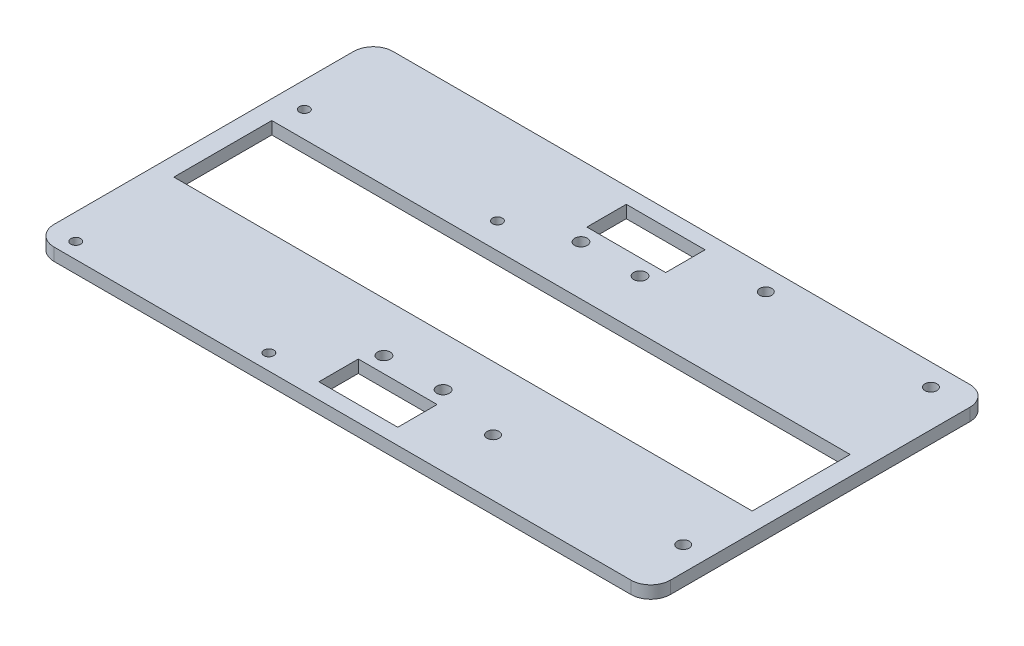
ISO-10303-21;
HEADER;
FILE_DESCRIPTION(('STEP AP214'),'2;1');
FILE_NAME('part.step','',(''),(''),'','','');
FILE_SCHEMA(('AUTOMOTIVE_DESIGN { 1 0 10303 214 1 1 1 1 }'));
ENDSEC;
DATA;
#1=APPLICATION_CONTEXT('core data for automotive mechanical design processes');
#2=APPLICATION_PROTOCOL_DEFINITION('international standard','automotive_design',2000,#1);
#3=PRODUCT_CONTEXT('',#1,'mechanical');
#4=PRODUCT('Part','Part','',(#3));
#5=PRODUCT_RELATED_PRODUCT_CATEGORY('part','',(#4));
#6=PRODUCT_DEFINITION_FORMATION('','',#4);
#7=PRODUCT_DEFINITION_CONTEXT('part definition',#1,'design');
#8=PRODUCT_DEFINITION('design','',#6,#7);
#9=PRODUCT_DEFINITION_SHAPE('','',#8);
#10=(LENGTH_UNIT() NAMED_UNIT(*) SI_UNIT(.MILLI.,.METRE.));
#11=(NAMED_UNIT(*) PLANE_ANGLE_UNIT() SI_UNIT($,.RADIAN.));
#12=(NAMED_UNIT(*) SI_UNIT($,.STERADIAN.) SOLID_ANGLE_UNIT());
#13=UNCERTAINTY_MEASURE_WITH_UNIT(LENGTH_MEASURE(1.E-05),#10,'distance_accuracy_value','');
#14=(GEOMETRIC_REPRESENTATION_CONTEXT(3) GLOBAL_UNCERTAINTY_ASSIGNED_CONTEXT((#13)) GLOBAL_UNIT_ASSIGNED_CONTEXT((#10,
#11,#12)) REPRESENTATION_CONTEXT('',''));
#15=CARTESIAN_POINT('',(0.,0.,0.));
#16=DIRECTION('',(0.,0.,1.));
#17=DIRECTION('',(1.,0.,0.));
#18=AXIS2_PLACEMENT_3D('',#15,#16,#17);
#19=CARTESIAN_POINT('',(78.2,3.175,-43.));
#20=DIRECTION('',(-1.,0.,0.));
#21=DIRECTION('',(0.,0.,1.));
#22=AXIS2_PLACEMENT_3D('',#19,#20,#21);
#23=PLANE('',#22);
#24=DIRECTION('',(0.,0.,-1.));
#25=VECTOR('',#24,1.);
#26=CARTESIAN_POINT('',(78.2,0.,-43.));
#27=LINE('',#26,#25);
#28=CARTESIAN_POINT('',(78.2,0.,38.));
#29=VERTEX_POINT('',#28);
#30=CARTESIAN_POINT('',(78.2,0.,-38.));
#31=VERTEX_POINT('',#30);
#32=EDGE_CURVE('E350',#29,#31,#27,.T.);
#33=ORIENTED_EDGE('',*,*,#32,.T.);
#34=DIRECTION('',(0.,-1.,0.));
#35=VECTOR('',#34,1.);
#36=CARTESIAN_POINT('',(78.2,3.175,-38.));
#37=LINE('',#36,#35);
#38=CARTESIAN_POINT('',(78.2,3.175,-38.));
#39=VERTEX_POINT('',#38);
#40=EDGE_CURVE('E11',#31,#39,#37,.F.);
#41=ORIENTED_EDGE('',*,*,#40,.T.);
#42=DIRECTION('',(0.,0.,-1.));
#43=VECTOR('',#42,1.);
#44=CARTESIAN_POINT('',(78.2,3.175,-43.));
#45=LINE('',#44,#43);
#46=CARTESIAN_POINT('',(78.2,3.175,38.));
#47=VERTEX_POINT('',#46);
#48=EDGE_CURVE('E353',#47,#39,#45,.T.);
#49=ORIENTED_EDGE('',*,*,#48,.F.);
#50=DIRECTION('',(0.,-1.,0.));
#51=VECTOR('',#50,1.);
#52=CARTESIAN_POINT('',(78.2,3.175,38.));
#53=LINE('',#52,#51);
#54=EDGE_CURVE('E43',#47,#29,#53,.T.);
#55=ORIENTED_EDGE('',*,*,#54,.T.);
#56=EDGE_LOOP('',(#33,#41,#49,#55));
#57=FACE_BOUND('',#56,.T.);
#58=ADVANCED_FACE('F35',(#57),#23,.F.);
#59=CARTESIAN_POINT('',(-78.2,3.175,-43.));
#60=DIRECTION('',(0.,0.,1.));
#61=DIRECTION('',(1.,0.,0.));
#62=AXIS2_PLACEMENT_3D('',#59,#60,#61);
#63=PLANE('',#62);
#64=DIRECTION('',(-1.,0.,0.));
#65=VECTOR('',#64,1.);
#66=CARTESIAN_POINT('',(-78.2,0.,-43.));
#67=LINE('',#66,#65);
#68=CARTESIAN_POINT('',(73.2,0.,-43.));
#69=VERTEX_POINT('',#68);
#70=CARTESIAN_POINT('',(-73.2,0.,-43.));
#71=VERTEX_POINT('',#70);
#72=EDGE_CURVE('E367',#69,#71,#67,.T.);
#73=ORIENTED_EDGE('',*,*,#72,.T.);
#74=DIRECTION('',(0.,-1.,0.));
#75=VECTOR('',#74,1.);
#76=CARTESIAN_POINT('',(-73.2,3.175,-43.));
#77=LINE('',#76,#75);
#78=CARTESIAN_POINT('',(-73.2,3.175,-43.));
#79=VERTEX_POINT('',#78);
#80=EDGE_CURVE('E389',#71,#79,#77,.F.);
#81=ORIENTED_EDGE('',*,*,#80,.T.);
#82=DIRECTION('',(-1.,0.,0.));
#83=VECTOR('',#82,1.);
#84=CARTESIAN_POINT('',(-78.2,3.175,-43.));
#85=LINE('',#84,#83);
#86=CARTESIAN_POINT('',(73.2,3.175,-43.));
#87=VERTEX_POINT('',#86);
#88=EDGE_CURVE('E356',#87,#79,#85,.T.);
#89=ORIENTED_EDGE('',*,*,#88,.F.);
#90=DIRECTION('',(0.,-1.,0.));
#91=VECTOR('',#90,1.);
#92=CARTESIAN_POINT('',(73.2,3.175,-43.));
#93=LINE('',#92,#91);
#94=EDGE_CURVE('E386',#87,#69,#93,.T.);
#95=ORIENTED_EDGE('',*,*,#94,.T.);
#96=EDGE_LOOP('',(#73,#81,#89,#95));
#97=FACE_BOUND('',#96,.T.);
#98=ADVANCED_FACE('F420',(#97),#63,.F.);
#99=CARTESIAN_POINT('',(-78.2,3.175,-43.));
#100=DIRECTION('',(1.,0.,0.));
#101=DIRECTION('',(0.,0.,-1.));
#102=AXIS2_PLACEMENT_3D('',#99,#100,#101);
#103=PLANE('',#102);
#104=DIRECTION('',(0.,0.,1.));
#105=VECTOR('',#104,1.);
#106=CARTESIAN_POINT('',(-78.2,3.175,-43.));
#107=LINE('',#106,#105);
#108=CARTESIAN_POINT('',(-78.2,3.175,-38.));
#109=VERTEX_POINT('',#108);
#110=CARTESIAN_POINT('',(-78.2,3.175,38.));
#111=VERTEX_POINT('',#110);
#112=EDGE_CURVE('E360',#109,#111,#107,.T.);
#113=ORIENTED_EDGE('',*,*,#112,.F.);
#114=DIRECTION('',(0.,-1.,0.));
#115=VECTOR('',#114,1.);
#116=CARTESIAN_POINT('',(-78.2,3.175,-38.));
#117=LINE('',#116,#115);
#118=CARTESIAN_POINT('',(-78.2,0.,-38.));
#119=VERTEX_POINT('',#118);
#120=EDGE_CURVE('E375',#109,#119,#117,.T.);
#121=ORIENTED_EDGE('',*,*,#120,.T.);
#122=DIRECTION('',(0.,0.,1.));
#123=VECTOR('',#122,1.);
#124=CARTESIAN_POINT('',(-78.2,0.,-43.));
#125=LINE('',#124,#123);
#126=CARTESIAN_POINT('',(-78.2,0.,38.));
#127=VERTEX_POINT('',#126);
#128=EDGE_CURVE('E370',#119,#127,#125,.T.);
#129=ORIENTED_EDGE('',*,*,#128,.T.);
#130=DIRECTION('',(0.,-1.,0.));
#131=VECTOR('',#130,1.);
#132=CARTESIAN_POINT('',(-78.2,3.175,38.));
#133=LINE('',#132,#131);
#134=EDGE_CURVE('E364',#127,#111,#133,.F.);
#135=ORIENTED_EDGE('',*,*,#134,.T.);
#136=EDGE_LOOP('',(#113,#121,#129,#135));
#137=FACE_BOUND('',#136,.T.);
#138=ADVANCED_FACE('F428',(#137),#103,.F.);
#139=CARTESIAN_POINT('',(-78.2,3.175,43.));
#140=DIRECTION('',(0.,0.,-1.));
#141=DIRECTION('',(-1.,0.,0.));
#142=AXIS2_PLACEMENT_3D('',#139,#140,#141);
#143=PLANE('',#142);
#144=DIRECTION('',(1.,0.,0.));
#145=VECTOR('',#144,1.);
#146=CARTESIAN_POINT('',(-78.2,3.175,43.));
#147=LINE('',#146,#145);
#148=CARTESIAN_POINT('',(-73.2,3.175,43.));
#149=VERTEX_POINT('',#148);
#150=CARTESIAN_POINT('',(73.2,3.175,43.));
#151=VERTEX_POINT('',#150);
#152=EDGE_CURVE('E362',#149,#151,#147,.T.);
#153=ORIENTED_EDGE('',*,*,#152,.F.);
#154=DIRECTION('',(0.,-1.,0.));
#155=VECTOR('',#154,1.);
#156=CARTESIAN_POINT('',(-73.2,3.175,43.));
#157=LINE('',#156,#155);
#158=CARTESIAN_POINT('',(-73.2,0.,43.));
#159=VERTEX_POINT('',#158);
#160=EDGE_CURVE('E399',#149,#159,#157,.T.);
#161=ORIENTED_EDGE('',*,*,#160,.T.);
#162=DIRECTION('',(1.,0.,0.));
#163=VECTOR('',#162,1.);
#164=CARTESIAN_POINT('',(-78.2,0.,43.));
#165=LINE('',#164,#163);
#166=CARTESIAN_POINT('',(73.2,0.,43.));
#167=VERTEX_POINT('',#166);
#168=EDGE_CURVE('E357',#159,#167,#165,.T.);
#169=ORIENTED_EDGE('',*,*,#168,.T.);
#170=DIRECTION('',(0.,-1.,0.));
#171=VECTOR('',#170,1.);
#172=CARTESIAN_POINT('',(73.2,3.175,43.));
#173=LINE('',#172,#171);
#174=EDGE_CURVE('E50',#167,#151,#173,.F.);
#175=ORIENTED_EDGE('',*,*,#174,.T.);
#176=EDGE_LOOP('',(#153,#161,#169,#175));
#177=FACE_BOUND('',#176,.T.);
#178=ADVANCED_FACE('F433',(#177),#143,.F.);
#179=CARTESIAN_POINT('',(0.,3.175,0.));
#180=DIRECTION('',(0.,1.,0.));
#181=DIRECTION('',(0.,0.,1.));
#182=AXIS2_PLACEMENT_3D('',#179,#180,#181);
#183=PLANE('',#182);
#184=DIRECTION('',(0.,0.,1.));
#185=VECTOR('',#184,1.);
#186=CARTESIAN_POINT('',(9.99999999999999,3.175,-29.));
#187=LINE('',#186,#185);
#188=CARTESIAN_POINT('',(9.99999999999999,3.175,-39.));
#189=VERTEX_POINT('',#188);
#190=CARTESIAN_POINT('',(9.99999999999999,3.175,-29.));
#191=VERTEX_POINT('',#190);
#192=EDGE_CURVE('E177',#189,#191,#187,.T.);
#193=ORIENTED_EDGE('',*,*,#192,.T.);
#194=DIRECTION('',(-1.,0.,0.));
#195=VECTOR('',#194,1.);
#196=CARTESIAN_POINT('',(9.99999999999999,3.175,-29.));
#197=LINE('',#196,#195);
#198=CARTESIAN_POINT('',(-10.,3.175,-29.));
#199=VERTEX_POINT('',#198);
#200=EDGE_CURVE('E189',#191,#199,#197,.T.);
#201=ORIENTED_EDGE('',*,*,#200,.T.);
#202=DIRECTION('',(0.,0.,-1.));
#203=VECTOR('',#202,1.);
#204=CARTESIAN_POINT('',(-10.,3.175,-29.));
#205=LINE('',#204,#203);
#206=CARTESIAN_POINT('',(-10.,3.175,-39.));
#207=VERTEX_POINT('',#206);
#208=EDGE_CURVE('E193',#199,#207,#205,.T.);
#209=ORIENTED_EDGE('',*,*,#208,.T.);
#210=DIRECTION('',(1.,0.,0.));
#211=VECTOR('',#210,1.);
#212=CARTESIAN_POINT('',(9.99999999999999,3.175,-39.));
#213=LINE('',#212,#211);
#214=EDGE_CURVE('E185',#207,#189,#213,.T.);
#215=ORIENTED_EDGE('',*,*,#214,.T.);
#216=EDGE_LOOP('',(#193,#201,#209,#215));
#217=FACE_BOUND('',#216,.T.);
#218=DIRECTION('',(0.,0.,-1.));
#219=VECTOR('',#218,1.);
#220=CARTESIAN_POINT('',(-10.,3.175,29.));
#221=LINE('',#220,#219);
#222=CARTESIAN_POINT('',(-10.,3.175,39.));
#223=VERTEX_POINT('',#222);
#224=CARTESIAN_POINT('',(-10.,3.175,29.));
#225=VERTEX_POINT('',#224);
#226=EDGE_CURVE('E217',#223,#225,#221,.T.);
#227=ORIENTED_EDGE('',*,*,#226,.T.);
#228=DIRECTION('',(1.,0.,0.));
#229=VECTOR('',#228,1.);
#230=CARTESIAN_POINT('',(9.99999999999999,3.175,29.));
#231=LINE('',#230,#229);
#232=CARTESIAN_POINT('',(9.99999999999999,3.175,29.));
#233=VERTEX_POINT('',#232);
#234=EDGE_CURVE('E220',#225,#233,#231,.T.);
#235=ORIENTED_EDGE('',*,*,#234,.T.);
#236=DIRECTION('',(0.,0.,1.));
#237=VECTOR('',#236,1.);
#238=CARTESIAN_POINT('',(9.99999999999999,3.175,29.));
#239=LINE('',#238,#237);
#240=CARTESIAN_POINT('',(9.99999999999999,3.175,39.));
#241=VERTEX_POINT('',#240);
#242=EDGE_CURVE('E224',#233,#241,#239,.T.);
#243=ORIENTED_EDGE('',*,*,#242,.T.);
#244=DIRECTION('',(-1.,0.,0.));
#245=VECTOR('',#244,1.);
#246=CARTESIAN_POINT('',(9.99999999999999,3.175,39.));
#247=LINE('',#246,#245);
#248=EDGE_CURVE('E227',#241,#223,#247,.T.);
#249=ORIENTED_EDGE('',*,*,#248,.T.);
#250=EDGE_LOOP('',(#227,#235,#243,#249));
#251=FACE_BOUND('',#250,.T.);
#252=CARTESIAN_POINT('',(7.5,3.175,25.));
#253=DIRECTION('',(0.,-1.,0.));
#254=DIRECTION('',(0.,0.,-1.));
#255=AXIS2_PLACEMENT_3D('',#252,#253,#254);
#256=CIRCLE('',#255,1.6);
#257=CARTESIAN_POINT('',(7.5,3.175,23.4));
#258=VERTEX_POINT('',#257);
#259=EDGE_CURVE('E249',#258,#258,#256,.T.);
#260=ORIENTED_EDGE('',*,*,#259,.T.);
#261=EDGE_LOOP('',(#260));
#262=FACE_BOUND('',#261,.T.);
#263=CARTESIAN_POINT('',(-7.5,3.175,25.));
#264=DIRECTION('',(0.,-1.,0.));
#265=DIRECTION('',(0.,0.,-1.));
#266=AXIS2_PLACEMENT_3D('',#263,#264,#265);
#267=CIRCLE('',#266,1.6);
#268=CARTESIAN_POINT('',(-7.5,3.175,23.4));
#269=VERTEX_POINT('',#268);
#270=EDGE_CURVE('E255',#269,#269,#267,.T.);
#271=ORIENTED_EDGE('',*,*,#270,.T.);
#272=EDGE_LOOP('',(#271));
#273=FACE_BOUND('',#272,.T.);
#274=CARTESIAN_POINT('',(-7.5,3.175,-25.));
#275=DIRECTION('',(0.,-1.,0.));
#276=DIRECTION('',(0.,0.,-1.));
#277=AXIS2_PLACEMENT_3D('',#274,#275,#276);
#278=CIRCLE('',#277,1.6);
#279=CARTESIAN_POINT('',(-7.5,3.175,-26.6));
#280=VERTEX_POINT('',#279);
#281=EDGE_CURVE('E261',#280,#280,#278,.T.);
#282=ORIENTED_EDGE('',*,*,#281,.T.);
#283=EDGE_LOOP('',(#282));
#284=FACE_BOUND('',#283,.T.);
#285=CARTESIAN_POINT('',(7.5,3.175,-25.));
#286=DIRECTION('',(0.,-1.,0.));
#287=DIRECTION('',(0.,0.,-1.));
#288=AXIS2_PLACEMENT_3D('',#285,#286,#287);
#289=CIRCLE('',#288,1.6);
#290=CARTESIAN_POINT('',(7.5,3.175,-26.6));
#291=VERTEX_POINT('',#290);
#292=EDGE_CURVE('E267',#291,#291,#289,.T.);
#293=ORIENTED_EDGE('',*,*,#292,.T.);
#294=EDGE_LOOP('',(#293));
#295=FACE_BOUND('',#294,.T.);
#296=DIRECTION('',(-1.,0.,0.));
#297=VECTOR('',#296,1.);
#298=CARTESIAN_POINT('',(73.39,3.175,12.4299999999999));
#299=LINE('',#298,#297);
#300=CARTESIAN_POINT('',(73.39,3.175,12.4299999999999));
#301=VERTEX_POINT('',#300);
#302=CARTESIAN_POINT('',(-73.39,3.175,12.4299999999999));
#303=VERTEX_POINT('',#302);
#304=EDGE_CURVE('E273',#301,#303,#299,.T.);
#305=ORIENTED_EDGE('',*,*,#304,.T.);
#306=DIRECTION('',(0.,0.,-1.));
#307=VECTOR('',#306,1.);
#308=CARTESIAN_POINT('',(-73.39,3.175,12.4299999999999));
#309=LINE('',#308,#307);
#310=CARTESIAN_POINT('',(-73.39,3.175,-12.4300000000001));
#311=VERTEX_POINT('',#310);
#312=EDGE_CURVE('E276',#303,#311,#309,.T.);
#313=ORIENTED_EDGE('',*,*,#312,.T.);
#314=DIRECTION('',(1.,0.,0.));
#315=VECTOR('',#314,1.);
#316=CARTESIAN_POINT('',(-73.39,3.175,-12.4300000000001));
#317=LINE('',#316,#315);
#318=CARTESIAN_POINT('',(73.39,3.175,-12.4300000000001));
#319=VERTEX_POINT('',#318);
#320=EDGE_CURVE('E280',#311,#319,#317,.T.);
#321=ORIENTED_EDGE('',*,*,#320,.T.);
#322=DIRECTION('',(0.,0.,1.));
#323=VECTOR('',#322,1.);
#324=CARTESIAN_POINT('',(73.39,3.175,-12.4300000000001));
#325=LINE('',#324,#323);
#326=EDGE_CURVE('E283',#319,#301,#325,.T.);
#327=ORIENTED_EDGE('',*,*,#326,.T.);
#328=EDGE_LOOP('',(#305,#313,#321,#327));
#329=FACE_BOUND('',#328,.T.);
#330=CARTESIAN_POINT('',(26.9399999999996,3.175,-37.4649999999998));
#331=DIRECTION('',(0.,-1.,0.));
#332=DIRECTION('',(0.,0.,-1.));
#333=AXIS2_PLACEMENT_3D('',#330,#331,#332);
#334=CIRCLE('',#333,1.52399999999991);
#335=CARTESIAN_POINT('',(26.9399999999996,3.175,-38.9889999999997));
#336=VERTEX_POINT('',#335);
#337=EDGE_CURVE('E305',#336,#336,#334,.T.);
#338=ORIENTED_EDGE('',*,*,#337,.T.);
#339=EDGE_LOOP('',(#338));
#340=FACE_BOUND('',#339,.T.);
#341=CARTESIAN_POINT('',(68.8499999999996,3.175,-37.4649999999999));
#342=DIRECTION('',(0.,-1.,0.));
#343=DIRECTION('',(0.,0.,-1.));
#344=AXIS2_PLACEMENT_3D('',#341,#342,#343);
#345=CIRCLE('',#344,1.5239999999999);
#346=CARTESIAN_POINT('',(68.8499999999996,3.175,-38.9889999999998));
#347=VERTEX_POINT('',#346);
#348=EDGE_CURVE('E311',#347,#347,#345,.T.);
#349=ORIENTED_EDGE('',*,*,#348,.T.);
#350=EDGE_LOOP('',(#349));
#351=FACE_BOUND('',#350,.T.);
#352=CARTESIAN_POINT('',(23.7649999999998,3.175,28.5750000000002));
#353=DIRECTION('',(0.,-1.,0.));
#354=DIRECTION('',(0.,0.,-1.));
#355=AXIS2_PLACEMENT_3D('',#352,#353,#354);
#356=CIRCLE('',#355,1.5239999999999);
#357=CARTESIAN_POINT('',(23.7649999999998,3.175,27.0510000000003));
#358=VERTEX_POINT('',#357);
#359=EDGE_CURVE('E317',#358,#358,#356,.T.);
#360=ORIENTED_EDGE('',*,*,#359,.T.);
#361=EDGE_LOOP('',(#360));
#362=FACE_BOUND('',#361,.T.);
#363=CARTESIAN_POINT('',(72.0249999999998,3.175,28.575));
#364=DIRECTION('',(0.,-1.,0.));
#365=DIRECTION('',(0.,0.,-1.));
#366=AXIS2_PLACEMENT_3D('',#363,#364,#365);
#367=CIRCLE('',#366,1.5239999999999);
#368=CARTESIAN_POINT('',(72.0249999999998,3.175,27.0510000000001));
#369=VERTEX_POINT('',#368);
#370=EDGE_CURVE('E323',#369,#369,#367,.T.);
#371=ORIENTED_EDGE('',*,*,#370,.T.);
#372=EDGE_LOOP('',(#371));
#373=FACE_BOUND('',#372,.T.);
#374=CARTESIAN_POINT('',(-22.6999999999866,3.175,39.0000000000137));
#375=DIRECTION('',(0.,-1.,0.));
#376=DIRECTION('',(0.,0.,-1.));
#377=AXIS2_PLACEMENT_3D('',#374,#375,#376);
#378=CIRCLE('',#377,1.24999999998659);
#379=CARTESIAN_POINT('',(-22.6999999999866,3.175,37.7500000000271));
#380=VERTEX_POINT('',#379);
#381=EDGE_CURVE('E329',#380,#380,#378,.T.);
#382=ORIENTED_EDGE('',*,*,#381,.T.);
#383=EDGE_LOOP('',(#382));
#384=FACE_BOUND('',#383,.T.);
#385=CARTESIAN_POINT('',(-71.6999999999725,3.175,39.0000000000137));
#386=DIRECTION('',(0.,-1.,0.));
#387=DIRECTION('',(0.,0.,-1.));
#388=AXIS2_PLACEMENT_3D('',#385,#386,#387);
#389=CIRCLE('',#388,1.24999999998656);
#390=CARTESIAN_POINT('',(-71.6999999999725,3.175,37.7500000000271));
#391=VERTEX_POINT('',#390);
#392=EDGE_CURVE('E335',#391,#391,#389,.T.);
#393=ORIENTED_EDGE('',*,*,#392,.T.);
#394=EDGE_LOOP('',(#393));
#395=FACE_BOUND('',#394,.T.);
#396=CARTESIAN_POINT('',(-71.6999999999725,3.175,-18.9999999999863));
#397=DIRECTION('',(0.,-1.,0.));
#398=DIRECTION('',(0.,0.,-1.));
#399=AXIS2_PLACEMENT_3D('',#396,#397,#398);
#400=CIRCLE('',#399,1.24999999998654);
#401=CARTESIAN_POINT('',(-71.6999999999725,3.175,-20.2499999999728));
#402=VERTEX_POINT('',#401);
#403=EDGE_CURVE('E341',#402,#402,#400,.T.);
#404=ORIENTED_EDGE('',*,*,#403,.T.);
#405=EDGE_LOOP('',(#404));
#406=FACE_BOUND('',#405,.T.);
#407=CARTESIAN_POINT('',(-22.6999999999865,3.175,-18.9999999999863));
#408=DIRECTION('',(0.,-1.,0.));
#409=DIRECTION('',(0.,0.,-1.));
#410=AXIS2_PLACEMENT_3D('',#407,#408,#409);
#411=CIRCLE('',#410,1.24999999998654);
#412=CARTESIAN_POINT('',(-22.6999999999865,3.175,-20.2499999999728));
#413=VERTEX_POINT('',#412);
#414=EDGE_CURVE('E347',#413,#413,#411,.T.);
#415=ORIENTED_EDGE('',*,*,#414,.T.);
#416=EDGE_LOOP('',(#415));
#417=FACE_BOUND('',#416,.T.);
#418=ORIENTED_EDGE('',*,*,#88,.T.);
#419=CARTESIAN_POINT('',(-73.2,3.175,-38.));
#420=DIRECTION('',(0.,1.,0.));
#421=DIRECTION('',(0.,0.,1.));
#422=AXIS2_PLACEMENT_3D('',#419,#420,#421);
#423=CIRCLE('',#422,5.);
#424=EDGE_CURVE('E396',#79,#109,#423,.T.);
#425=ORIENTED_EDGE('',*,*,#424,.T.);
#426=ORIENTED_EDGE('',*,*,#112,.T.);
#427=CARTESIAN_POINT('',(-73.2,3.175,38.));
#428=DIRECTION('',(0.,1.,0.));
#429=DIRECTION('',(0.,0.,1.));
#430=AXIS2_PLACEMENT_3D('',#427,#428,#429);
#431=CIRCLE('',#430,5.);
#432=EDGE_CURVE('E57',#111,#149,#431,.T.);
#433=ORIENTED_EDGE('',*,*,#432,.T.);
#434=ORIENTED_EDGE('',*,*,#152,.T.);
#435=CARTESIAN_POINT('',(73.2,3.175,38.));
#436=DIRECTION('',(0.,1.,0.));
#437=DIRECTION('',(0.,0.,1.));
#438=AXIS2_PLACEMENT_3D('',#435,#436,#437);
#439=CIRCLE('',#438,5.);
#440=EDGE_CURVE('E391',#151,#47,#439,.T.);
#441=ORIENTED_EDGE('',*,*,#440,.T.);
#442=ORIENTED_EDGE('',*,*,#48,.T.);
#443=CARTESIAN_POINT('',(73.2,3.175,-38.));
#444=DIRECTION('',(0.,1.,0.));
#445=DIRECTION('',(0.,0.,1.));
#446=AXIS2_PLACEMENT_3D('',#443,#444,#445);
#447=CIRCLE('',#446,5.);
#448=EDGE_CURVE('E393',#39,#87,#447,.T.);
#449=ORIENTED_EDGE('',*,*,#448,.T.);
#450=EDGE_LOOP('',(#418,#425,#426,#433,#434,#441,#442,#449));
#451=FACE_BOUND('',#450,.T.);
#452=ADVANCED_FACE('F195',(#217,#251,#262,#273,#284,#295,#329,#340,#351,#362,#373,#384,#395,
#406,#417,#451),#183,.T.);
#453=CARTESIAN_POINT('',(0.,0.,0.));
#454=DIRECTION('',(0.,1.,0.));
#455=DIRECTION('',(0.,0.,1.));
#456=AXIS2_PLACEMENT_3D('',#453,#454,#455);
#457=PLANE('',#456);
#458=DIRECTION('',(-1.,0.,0.));
#459=VECTOR('',#458,1.);
#460=CARTESIAN_POINT('',(9.99999999999999,0.,-29.));
#461=LINE('',#460,#459);
#462=CARTESIAN_POINT('',(9.99999999999999,0.,-29.));
#463=VERTEX_POINT('',#462);
#464=CARTESIAN_POINT('',(-10.,0.,-29.));
#465=VERTEX_POINT('',#464);
#466=EDGE_CURVE('E207',#463,#465,#461,.T.);
#467=ORIENTED_EDGE('',*,*,#466,.F.);
#468=DIRECTION('',(0.,0.,1.));
#469=VECTOR('',#468,1.);
#470=CARTESIAN_POINT('',(9.99999999999999,0.,-29.));
#471=LINE('',#470,#469);
#472=CARTESIAN_POINT('',(9.99999999999999,0.,-39.));
#473=VERTEX_POINT('',#472);
#474=EDGE_CURVE('E180',#473,#463,#471,.T.);
#475=ORIENTED_EDGE('',*,*,#474,.F.);
#476=DIRECTION('',(1.,0.,0.));
#477=VECTOR('',#476,1.);
#478=CARTESIAN_POINT('',(9.99999999999999,0.,-39.));
#479=LINE('',#478,#477);
#480=CARTESIAN_POINT('',(-10.,0.,-39.));
#481=VERTEX_POINT('',#480);
#482=EDGE_CURVE('E198',#481,#473,#479,.T.);
#483=ORIENTED_EDGE('',*,*,#482,.F.);
#484=DIRECTION('',(0.,0.,-1.));
#485=VECTOR('',#484,1.);
#486=CARTESIAN_POINT('',(-10.,0.,-29.));
#487=LINE('',#486,#485);
#488=EDGE_CURVE('E201',#465,#481,#487,.T.);
#489=ORIENTED_EDGE('',*,*,#488,.F.);
#490=EDGE_LOOP('',(#467,#475,#483,#489));
#491=FACE_BOUND('',#490,.T.);
#492=DIRECTION('',(1.,0.,0.));
#493=VECTOR('',#492,1.);
#494=CARTESIAN_POINT('',(9.99999999999999,0.,29.));
#495=LINE('',#494,#493);
#496=CARTESIAN_POINT('',(-10.,0.,29.));
#497=VERTEX_POINT('',#496);
#498=CARTESIAN_POINT('',(9.99999999999999,0.,29.));
#499=VERTEX_POINT('',#498);
#500=EDGE_CURVE('E232',#497,#499,#495,.T.);
#501=ORIENTED_EDGE('',*,*,#500,.F.);
#502=DIRECTION('',(0.,0.,-1.));
#503=VECTOR('',#502,1.);
#504=CARTESIAN_POINT('',(-10.,0.,29.));
#505=LINE('',#504,#503);
#506=CARTESIAN_POINT('',(-10.,0.,39.));
#507=VERTEX_POINT('',#506);
#508=EDGE_CURVE('E213',#507,#497,#505,.T.);
#509=ORIENTED_EDGE('',*,*,#508,.F.);
#510=DIRECTION('',(-1.,0.,0.));
#511=VECTOR('',#510,1.);
#512=CARTESIAN_POINT('',(9.99999999999999,0.,39.));
#513=LINE('',#512,#511);
#514=CARTESIAN_POINT('',(9.99999999999999,0.,39.));
#515=VERTEX_POINT('',#514);
#516=EDGE_CURVE('E221',#515,#507,#513,.T.);
#517=ORIENTED_EDGE('',*,*,#516,.F.);
#518=DIRECTION('',(0.,0.,1.));
#519=VECTOR('',#518,1.);
#520=CARTESIAN_POINT('',(9.99999999999999,0.,29.));
#521=LINE('',#520,#519);
#522=EDGE_CURVE('E235',#499,#515,#521,.T.);
#523=ORIENTED_EDGE('',*,*,#522,.F.);
#524=EDGE_LOOP('',(#501,#509,#517,#523));
#525=FACE_BOUND('',#524,.T.);
#526=CARTESIAN_POINT('',(7.5,0.,25.));
#527=DIRECTION('',(0.,-1.,0.));
#528=DIRECTION('',(0.,0.,-1.));
#529=AXIS2_PLACEMENT_3D('',#526,#527,#528);
#530=CIRCLE('',#529,1.6);
#531=CARTESIAN_POINT('',(7.5,0.,23.4));
#532=VERTEX_POINT('',#531);
#533=EDGE_CURVE('E242',#532,#532,#530,.T.);
#534=ORIENTED_EDGE('',*,*,#533,.F.);
#535=EDGE_LOOP('',(#534));
#536=FACE_BOUND('',#535,.T.);
#537=CARTESIAN_POINT('',(-7.5,0.,25.));
#538=DIRECTION('',(0.,-1.,0.));
#539=DIRECTION('',(0.,0.,-1.));
#540=AXIS2_PLACEMENT_3D('',#537,#538,#539);
#541=CIRCLE('',#540,1.6);
#542=CARTESIAN_POINT('',(-7.5,0.,23.4));
#543=VERTEX_POINT('',#542);
#544=EDGE_CURVE('E252',#543,#543,#541,.T.);
#545=ORIENTED_EDGE('',*,*,#544,.F.);
#546=EDGE_LOOP('',(#545));
#547=FACE_BOUND('',#546,.T.);
#548=CARTESIAN_POINT('',(-7.5,0.,-25.));
#549=DIRECTION('',(0.,-1.,0.));
#550=DIRECTION('',(0.,0.,-1.));
#551=AXIS2_PLACEMENT_3D('',#548,#549,#550);
#552=CIRCLE('',#551,1.6);
#553=CARTESIAN_POINT('',(-7.5,0.,-26.6));
#554=VERTEX_POINT('',#553);
#555=EDGE_CURVE('E258',#554,#554,#552,.T.);
#556=ORIENTED_EDGE('',*,*,#555,.F.);
#557=EDGE_LOOP('',(#556));
#558=FACE_BOUND('',#557,.T.);
#559=CARTESIAN_POINT('',(7.5,0.,-25.));
#560=DIRECTION('',(0.,-1.,0.));
#561=DIRECTION('',(0.,0.,-1.));
#562=AXIS2_PLACEMENT_3D('',#559,#560,#561);
#563=CIRCLE('',#562,1.6);
#564=CARTESIAN_POINT('',(7.5,0.,-26.6));
#565=VERTEX_POINT('',#564);
#566=EDGE_CURVE('E264',#565,#565,#563,.T.);
#567=ORIENTED_EDGE('',*,*,#566,.F.);
#568=EDGE_LOOP('',(#567));
#569=FACE_BOUND('',#568,.T.);
#570=DIRECTION('',(0.,0.,-1.));
#571=VECTOR('',#570,1.);
#572=CARTESIAN_POINT('',(-73.39,0.,12.4299999999999));
#573=LINE('',#572,#571);
#574=CARTESIAN_POINT('',(-73.39,0.,12.4299999999999));
#575=VERTEX_POINT('',#574);
#576=CARTESIAN_POINT('',(-73.39,0.,-12.4300000000001));
#577=VERTEX_POINT('',#576);
#578=EDGE_CURVE('E288',#575,#577,#573,.T.);
#579=ORIENTED_EDGE('',*,*,#578,.F.);
#580=DIRECTION('',(-1.,0.,0.));
#581=VECTOR('',#580,1.);
#582=CARTESIAN_POINT('',(73.39,0.,12.4299999999999));
#583=LINE('',#582,#581);
#584=CARTESIAN_POINT('',(73.39,0.,12.4299999999999));
#585=VERTEX_POINT('',#584);
#586=EDGE_CURVE('E270',#585,#575,#583,.T.);
#587=ORIENTED_EDGE('',*,*,#586,.F.);
#588=DIRECTION('',(0.,0.,1.));
#589=VECTOR('',#588,1.);
#590=CARTESIAN_POINT('',(73.39,0.,-12.4300000000001));
#591=LINE('',#590,#589);
#592=CARTESIAN_POINT('',(73.39,0.,-12.4300000000001));
#593=VERTEX_POINT('',#592);
#594=EDGE_CURVE('E277',#593,#585,#591,.T.);
#595=ORIENTED_EDGE('',*,*,#594,.F.);
#596=DIRECTION('',(1.,0.,0.));
#597=VECTOR('',#596,1.);
#598=CARTESIAN_POINT('',(-73.39,0.,-12.4300000000001));
#599=LINE('',#598,#597);
#600=EDGE_CURVE('E291',#577,#593,#599,.T.);
#601=ORIENTED_EDGE('',*,*,#600,.F.);
#602=EDGE_LOOP('',(#579,#587,#595,#601));
#603=FACE_BOUND('',#602,.T.);
#604=CARTESIAN_POINT('',(26.9399999999996,0.,-37.4649999999998));
#605=DIRECTION('',(0.,-1.,0.));
#606=DIRECTION('',(0.,0.,-1.));
#607=AXIS2_PLACEMENT_3D('',#604,#605,#606);
#608=CIRCLE('',#607,1.52399999999991);
#609=CARTESIAN_POINT('',(26.9399999999996,0.,-38.9889999999997));
#610=VERTEX_POINT('',#609);
#611=EDGE_CURVE('E298',#610,#610,#608,.T.);
#612=ORIENTED_EDGE('',*,*,#611,.F.);
#613=EDGE_LOOP('',(#612));
#614=FACE_BOUND('',#613,.T.);
#615=CARTESIAN_POINT('',(68.8499999999996,0.,-37.4649999999999));
#616=DIRECTION('',(0.,-1.,0.));
#617=DIRECTION('',(0.,0.,-1.));
#618=AXIS2_PLACEMENT_3D('',#615,#616,#617);
#619=CIRCLE('',#618,1.5239999999999);
#620=CARTESIAN_POINT('',(68.8499999999996,0.,-38.9889999999998));
#621=VERTEX_POINT('',#620);
#622=EDGE_CURVE('E308',#621,#621,#619,.T.);
#623=ORIENTED_EDGE('',*,*,#622,.F.);
#624=EDGE_LOOP('',(#623));
#625=FACE_BOUND('',#624,.T.);
#626=CARTESIAN_POINT('',(23.7649999999998,0.,28.5750000000002));
#627=DIRECTION('',(0.,-1.,0.));
#628=DIRECTION('',(0.,0.,-1.));
#629=AXIS2_PLACEMENT_3D('',#626,#627,#628);
#630=CIRCLE('',#629,1.5239999999999);
#631=CARTESIAN_POINT('',(23.7649999999998,0.,27.0510000000003));
#632=VERTEX_POINT('',#631);
#633=EDGE_CURVE('E314',#632,#632,#630,.T.);
#634=ORIENTED_EDGE('',*,*,#633,.F.);
#635=EDGE_LOOP('',(#634));
#636=FACE_BOUND('',#635,.T.);
#637=CARTESIAN_POINT('',(72.0249999999998,0.,28.575));
#638=DIRECTION('',(0.,-1.,0.));
#639=DIRECTION('',(0.,0.,-1.));
#640=AXIS2_PLACEMENT_3D('',#637,#638,#639);
#641=CIRCLE('',#640,1.5239999999999);
#642=CARTESIAN_POINT('',(72.0249999999998,0.,27.0510000000001));
#643=VERTEX_POINT('',#642);
#644=EDGE_CURVE('E320',#643,#643,#641,.T.);
#645=ORIENTED_EDGE('',*,*,#644,.F.);
#646=EDGE_LOOP('',(#645));
#647=FACE_BOUND('',#646,.T.);
#648=CARTESIAN_POINT('',(-22.6999999999866,0.,39.0000000000137));
#649=DIRECTION('',(0.,-1.,0.));
#650=DIRECTION('',(0.,0.,-1.));
#651=AXIS2_PLACEMENT_3D('',#648,#649,#650);
#652=CIRCLE('',#651,1.24999999998659);
#653=CARTESIAN_POINT('',(-22.6999999999866,0.,37.7500000000271));
#654=VERTEX_POINT('',#653);
#655=EDGE_CURVE('E326',#654,#654,#652,.T.);
#656=ORIENTED_EDGE('',*,*,#655,.F.);
#657=EDGE_LOOP('',(#656));
#658=FACE_BOUND('',#657,.T.);
#659=CARTESIAN_POINT('',(-71.6999999999725,0.,39.0000000000137));
#660=DIRECTION('',(0.,-1.,0.));
#661=DIRECTION('',(0.,0.,-1.));
#662=AXIS2_PLACEMENT_3D('',#659,#660,#661);
#663=CIRCLE('',#662,1.24999999998656);
#664=CARTESIAN_POINT('',(-71.6999999999725,0.,37.7500000000271));
#665=VERTEX_POINT('',#664);
#666=EDGE_CURVE('E332',#665,#665,#663,.T.);
#667=ORIENTED_EDGE('',*,*,#666,.F.);
#668=EDGE_LOOP('',(#667));
#669=FACE_BOUND('',#668,.T.);
#670=CARTESIAN_POINT('',(-71.6999999999725,0.,-18.9999999999863));
#671=DIRECTION('',(0.,-1.,0.));
#672=DIRECTION('',(0.,0.,-1.));
#673=AXIS2_PLACEMENT_3D('',#670,#671,#672);
#674=CIRCLE('',#673,1.24999999998654);
#675=CARTESIAN_POINT('',(-71.6999999999725,0.,-20.2499999999728));
#676=VERTEX_POINT('',#675);
#677=EDGE_CURVE('E338',#676,#676,#674,.T.);
#678=ORIENTED_EDGE('',*,*,#677,.F.);
#679=EDGE_LOOP('',(#678));
#680=FACE_BOUND('',#679,.T.);
#681=CARTESIAN_POINT('',(-22.6999999999865,0.,-18.9999999999863));
#682=DIRECTION('',(0.,-1.,0.));
#683=DIRECTION('',(0.,0.,-1.));
#684=AXIS2_PLACEMENT_3D('',#681,#682,#683);
#685=CIRCLE('',#684,1.24999999998654);
#686=CARTESIAN_POINT('',(-22.6999999999865,0.,-20.2499999999728));
#687=VERTEX_POINT('',#686);
#688=EDGE_CURVE('E344',#687,#687,#685,.T.);
#689=ORIENTED_EDGE('',*,*,#688,.F.);
#690=EDGE_LOOP('',(#689));
#691=FACE_BOUND('',#690,.T.);
#692=ORIENTED_EDGE('',*,*,#128,.F.);
#693=CARTESIAN_POINT('',(-73.2,0.,-38.));
#694=DIRECTION('',(0.,1.,0.));
#695=DIRECTION('',(0.,0.,1.));
#696=AXIS2_PLACEMENT_3D('',#693,#694,#695);
#697=CIRCLE('',#696,5.);
#698=EDGE_CURVE('E384',#119,#71,#697,.F.);
#699=ORIENTED_EDGE('',*,*,#698,.T.);
#700=ORIENTED_EDGE('',*,*,#72,.F.);
#701=CARTESIAN_POINT('',(73.2,0.,-38.));
#702=DIRECTION('',(0.,1.,0.));
#703=DIRECTION('',(0.,0.,1.));
#704=AXIS2_PLACEMENT_3D('',#701,#702,#703);
#705=CIRCLE('',#704,5.);
#706=EDGE_CURVE('E380',#69,#31,#705,.F.);
#707=ORIENTED_EDGE('',*,*,#706,.T.);
#708=ORIENTED_EDGE('',*,*,#32,.F.);
#709=CARTESIAN_POINT('',(73.2,0.,38.));
#710=DIRECTION('',(0.,1.,0.));
#711=DIRECTION('',(0.,0.,1.));
#712=AXIS2_PLACEMENT_3D('',#709,#710,#711);
#713=CIRCLE('',#712,5.);
#714=EDGE_CURVE('E378',#29,#167,#713,.F.);
#715=ORIENTED_EDGE('',*,*,#714,.T.);
#716=ORIENTED_EDGE('',*,*,#168,.F.);
#717=CARTESIAN_POINT('',(-73.2,0.,38.));
#718=DIRECTION('',(0.,1.,0.));
#719=DIRECTION('',(0.,0.,1.));
#720=AXIS2_PLACEMENT_3D('',#717,#718,#719);
#721=CIRCLE('',#720,5.);
#722=EDGE_CURVE('E382',#159,#127,#721,.F.);
#723=ORIENTED_EDGE('',*,*,#722,.T.);
#724=EDGE_LOOP('',(#692,#699,#700,#707,#708,#715,#716,#723));
#725=FACE_BOUND('',#724,.T.);
#726=ADVANCED_FACE('F411',(#491,#525,#536,#547,#558,#569,#603,#614,#625,#636,#647,#658,#669,
#680,#691,#725),#457,.F.);
#727=CARTESIAN_POINT('',(-22.6999999999865,3.175,-18.9999999999863));
#728=DIRECTION('',(0.,-1.,0.));
#729=DIRECTION('',(0.,0.,-1.));
#730=AXIS2_PLACEMENT_3D('',#727,#728,#729);
#731=CYLINDRICAL_SURFACE('',#730,1.24999999998654);
#732=ORIENTED_EDGE('',*,*,#414,.F.);
#733=EDGE_LOOP('',(#732));
#734=FACE_BOUND('',#733,.T.);
#735=ORIENTED_EDGE('',*,*,#688,.T.);
#736=EDGE_LOOP('',(#735));
#737=FACE_BOUND('',#736,.T.);
#738=ADVANCED_FACE('F673',(#734,#737),#731,.F.);
#739=CARTESIAN_POINT('',(-71.6999999999725,3.175,-18.9999999999863));
#740=DIRECTION('',(0.,-1.,0.));
#741=DIRECTION('',(0.,0.,-1.));
#742=AXIS2_PLACEMENT_3D('',#739,#740,#741);
#743=CYLINDRICAL_SURFACE('',#742,1.24999999998654);
#744=ORIENTED_EDGE('',*,*,#403,.F.);
#745=EDGE_LOOP('',(#744));
#746=FACE_BOUND('',#745,.T.);
#747=ORIENTED_EDGE('',*,*,#677,.T.);
#748=EDGE_LOOP('',(#747));
#749=FACE_BOUND('',#748,.T.);
#750=ADVANCED_FACE('F664',(#746,#749),#743,.F.);
#751=CARTESIAN_POINT('',(-71.6999999999725,3.175,39.0000000000137));
#752=DIRECTION('',(0.,-1.,0.));
#753=DIRECTION('',(0.,0.,-1.));
#754=AXIS2_PLACEMENT_3D('',#751,#752,#753);
#755=CYLINDRICAL_SURFACE('',#754,1.24999999998656);
#756=ORIENTED_EDGE('',*,*,#392,.F.);
#757=EDGE_LOOP('',(#756));
#758=FACE_BOUND('',#757,.T.);
#759=ORIENTED_EDGE('',*,*,#666,.T.);
#760=EDGE_LOOP('',(#759));
#761=FACE_BOUND('',#760,.T.);
#762=ADVANCED_FACE('F655',(#758,#761),#755,.F.);
#763=CARTESIAN_POINT('',(-22.6999999999866,3.175,39.0000000000137));
#764=DIRECTION('',(0.,-1.,0.));
#765=DIRECTION('',(0.,0.,-1.));
#766=AXIS2_PLACEMENT_3D('',#763,#764,#765);
#767=CYLINDRICAL_SURFACE('',#766,1.24999999998659);
#768=ORIENTED_EDGE('',*,*,#381,.F.);
#769=EDGE_LOOP('',(#768));
#770=FACE_BOUND('',#769,.T.);
#771=ORIENTED_EDGE('',*,*,#655,.T.);
#772=EDGE_LOOP('',(#771));
#773=FACE_BOUND('',#772,.T.);
#774=ADVANCED_FACE('F646',(#770,#773),#767,.F.);
#775=CARTESIAN_POINT('',(72.0249999999998,3.175,28.575));
#776=DIRECTION('',(0.,-1.,0.));
#777=DIRECTION('',(0.,0.,-1.));
#778=AXIS2_PLACEMENT_3D('',#775,#776,#777);
#779=CYLINDRICAL_SURFACE('',#778,1.5239999999999);
#780=ORIENTED_EDGE('',*,*,#370,.F.);
#781=EDGE_LOOP('',(#780));
#782=FACE_BOUND('',#781,.T.);
#783=ORIENTED_EDGE('',*,*,#644,.T.);
#784=EDGE_LOOP('',(#783));
#785=FACE_BOUND('',#784,.T.);
#786=ADVANCED_FACE('F637',(#782,#785),#779,.F.);
#787=CARTESIAN_POINT('',(23.7649999999998,3.175,28.5750000000002));
#788=DIRECTION('',(0.,-1.,0.));
#789=DIRECTION('',(0.,0.,-1.));
#790=AXIS2_PLACEMENT_3D('',#787,#788,#789);
#791=CYLINDRICAL_SURFACE('',#790,1.5239999999999);
#792=ORIENTED_EDGE('',*,*,#359,.F.);
#793=EDGE_LOOP('',(#792));
#794=FACE_BOUND('',#793,.T.);
#795=ORIENTED_EDGE('',*,*,#633,.T.);
#796=EDGE_LOOP('',(#795));
#797=FACE_BOUND('',#796,.T.);
#798=ADVANCED_FACE('F628',(#794,#797),#791,.F.);
#799=CARTESIAN_POINT('',(68.8499999999996,3.175,-37.4649999999999));
#800=DIRECTION('',(0.,-1.,0.));
#801=DIRECTION('',(0.,0.,-1.));
#802=AXIS2_PLACEMENT_3D('',#799,#800,#801);
#803=CYLINDRICAL_SURFACE('',#802,1.5239999999999);
#804=ORIENTED_EDGE('',*,*,#348,.F.);
#805=EDGE_LOOP('',(#804));
#806=FACE_BOUND('',#805,.T.);
#807=ORIENTED_EDGE('',*,*,#622,.T.);
#808=EDGE_LOOP('',(#807));
#809=FACE_BOUND('',#808,.T.);
#810=ADVANCED_FACE('F619',(#806,#809),#803,.F.);
#811=CARTESIAN_POINT('',(26.9399999999996,3.175,-37.4649999999998));
#812=DIRECTION('',(0.,-1.,0.));
#813=DIRECTION('',(0.,0.,-1.));
#814=AXIS2_PLACEMENT_3D('',#811,#812,#813);
#815=CYLINDRICAL_SURFACE('',#814,1.52399999999991);
#816=ORIENTED_EDGE('',*,*,#337,.F.);
#817=EDGE_LOOP('',(#816));
#818=FACE_BOUND('',#817,.T.);
#819=ORIENTED_EDGE('',*,*,#611,.T.);
#820=EDGE_LOOP('',(#819));
#821=FACE_BOUND('',#820,.T.);
#822=ADVANCED_FACE('F610',(#818,#821),#815,.F.);
#823=CARTESIAN_POINT('',(73.39,3.175,12.4299999999999));
#824=DIRECTION('',(0.,0.,1.));
#825=DIRECTION('',(1.,0.,0.));
#826=AXIS2_PLACEMENT_3D('',#823,#824,#825);
#827=PLANE('',#826);
#828=ORIENTED_EDGE('',*,*,#586,.T.);
#829=DIRECTION('',(0.,-1.,0.));
#830=VECTOR('',#829,1.);
#831=CARTESIAN_POINT('',(-73.39,3.175,12.4299999999999));
#832=LINE('',#831,#830);
#833=EDGE_CURVE('E286',#303,#575,#832,.T.);
#834=ORIENTED_EDGE('',*,*,#833,.F.);
#835=ORIENTED_EDGE('',*,*,#304,.F.);
#836=DIRECTION('',(0.,-1.,0.));
#837=VECTOR('',#836,1.);
#838=CARTESIAN_POINT('',(73.39,3.175,12.4299999999999));
#839=LINE('',#838,#837);
#840=EDGE_CURVE('E296',#301,#585,#839,.T.);
#841=ORIENTED_EDGE('',*,*,#840,.T.);
#842=EDGE_LOOP('',(#828,#834,#835,#841));
#843=FACE_BOUND('',#842,.T.);
#844=ADVANCED_FACE('F601',(#843),#827,.F.);
#845=CARTESIAN_POINT('',(73.39,3.175,-12.4300000000001));
#846=DIRECTION('',(1.,0.,0.));
#847=DIRECTION('',(0.,0.,-1.));
#848=AXIS2_PLACEMENT_3D('',#845,#846,#847);
#849=PLANE('',#848);
#850=ORIENTED_EDGE('',*,*,#594,.T.);
#851=ORIENTED_EDGE('',*,*,#840,.F.);
#852=ORIENTED_EDGE('',*,*,#326,.F.);
#853=DIRECTION('',(0.,-1.,0.));
#854=VECTOR('',#853,1.);
#855=CARTESIAN_POINT('',(73.39,3.175,-12.4300000000001));
#856=LINE('',#855,#854);
#857=EDGE_CURVE('E299',#319,#593,#856,.T.);
#858=ORIENTED_EDGE('',*,*,#857,.T.);
#859=EDGE_LOOP('',(#850,#851,#852,#858));
#860=FACE_BOUND('',#859,.T.);
#861=ADVANCED_FACE('F592',(#860),#849,.F.);
#862=CARTESIAN_POINT('',(-73.39,3.175,-12.4300000000001));
#863=DIRECTION('',(0.,0.,-1.));
#864=DIRECTION('',(-1.,0.,0.));
#865=AXIS2_PLACEMENT_3D('',#862,#863,#864);
#866=PLANE('',#865);
#867=ORIENTED_EDGE('',*,*,#600,.T.);
#868=ORIENTED_EDGE('',*,*,#857,.F.);
#869=ORIENTED_EDGE('',*,*,#320,.F.);
#870=DIRECTION('',(0.,-1.,0.));
#871=VECTOR('',#870,1.);
#872=CARTESIAN_POINT('',(-73.39,3.175,-12.4300000000001));
#873=LINE('',#872,#871);
#874=EDGE_CURVE('E301',#311,#577,#873,.T.);
#875=ORIENTED_EDGE('',*,*,#874,.T.);
#876=EDGE_LOOP('',(#867,#868,#869,#875));
#877=FACE_BOUND('',#876,.T.);
#878=ADVANCED_FACE('F583',(#877),#866,.F.);
#879=CARTESIAN_POINT('',(-73.39,3.175,12.4299999999999));
#880=DIRECTION('',(-1.,0.,0.));
#881=DIRECTION('',(0.,0.,1.));
#882=AXIS2_PLACEMENT_3D('',#879,#880,#881);
#883=PLANE('',#882);
#884=ORIENTED_EDGE('',*,*,#578,.T.);
#885=ORIENTED_EDGE('',*,*,#874,.F.);
#886=ORIENTED_EDGE('',*,*,#312,.F.);
#887=ORIENTED_EDGE('',*,*,#833,.T.);
#888=EDGE_LOOP('',(#884,#885,#886,#887));
#889=FACE_BOUND('',#888,.T.);
#890=ADVANCED_FACE('F574',(#889),#883,.F.);
#891=CARTESIAN_POINT('',(7.5,3.175,-25.));
#892=DIRECTION('',(0.,-1.,0.));
#893=DIRECTION('',(0.,0.,-1.));
#894=AXIS2_PLACEMENT_3D('',#891,#892,#893);
#895=CYLINDRICAL_SURFACE('',#894,1.6);
#896=ORIENTED_EDGE('',*,*,#292,.F.);
#897=EDGE_LOOP('',(#896));
#898=FACE_BOUND('',#897,.T.);
#899=ORIENTED_EDGE('',*,*,#566,.T.);
#900=EDGE_LOOP('',(#899));
#901=FACE_BOUND('',#900,.T.);
#902=ADVANCED_FACE('F565',(#898,#901),#895,.F.);
#903=CARTESIAN_POINT('',(-7.5,3.175,-25.));
#904=DIRECTION('',(0.,-1.,0.));
#905=DIRECTION('',(0.,0.,-1.));
#906=AXIS2_PLACEMENT_3D('',#903,#904,#905);
#907=CYLINDRICAL_SURFACE('',#906,1.6);
#908=ORIENTED_EDGE('',*,*,#281,.F.);
#909=EDGE_LOOP('',(#908));
#910=FACE_BOUND('',#909,.T.);
#911=ORIENTED_EDGE('',*,*,#555,.T.);
#912=EDGE_LOOP('',(#911));
#913=FACE_BOUND('',#912,.T.);
#914=ADVANCED_FACE('F556',(#910,#913),#907,.F.);
#915=CARTESIAN_POINT('',(-7.5,3.175,25.));
#916=DIRECTION('',(0.,-1.,0.));
#917=DIRECTION('',(0.,0.,-1.));
#918=AXIS2_PLACEMENT_3D('',#915,#916,#917);
#919=CYLINDRICAL_SURFACE('',#918,1.6);
#920=ORIENTED_EDGE('',*,*,#270,.F.);
#921=EDGE_LOOP('',(#920));
#922=FACE_BOUND('',#921,.T.);
#923=ORIENTED_EDGE('',*,*,#544,.T.);
#924=EDGE_LOOP('',(#923));
#925=FACE_BOUND('',#924,.T.);
#926=ADVANCED_FACE('F547',(#922,#925),#919,.F.);
#927=CARTESIAN_POINT('',(7.5,3.175,25.));
#928=DIRECTION('',(0.,-1.,0.));
#929=DIRECTION('',(0.,0.,-1.));
#930=AXIS2_PLACEMENT_3D('',#927,#928,#929);
#931=CYLINDRICAL_SURFACE('',#930,1.6);
#932=ORIENTED_EDGE('',*,*,#259,.F.);
#933=EDGE_LOOP('',(#932));
#934=FACE_BOUND('',#933,.T.);
#935=ORIENTED_EDGE('',*,*,#533,.T.);
#936=EDGE_LOOP('',(#935));
#937=FACE_BOUND('',#936,.T.);
#938=ADVANCED_FACE('F538',(#934,#937),#931,.F.);
#939=CARTESIAN_POINT('',(-10.,3.175,29.));
#940=DIRECTION('',(-1.,0.,0.));
#941=DIRECTION('',(0.,0.,1.));
#942=AXIS2_PLACEMENT_3D('',#939,#940,#941);
#943=PLANE('',#942);
#944=ORIENTED_EDGE('',*,*,#508,.T.);
#945=DIRECTION('',(0.,-1.,0.));
#946=VECTOR('',#945,1.);
#947=CARTESIAN_POINT('',(-10.,3.175,29.));
#948=LINE('',#947,#946);
#949=EDGE_CURVE('E230',#225,#497,#948,.T.);
#950=ORIENTED_EDGE('',*,*,#949,.F.);
#951=ORIENTED_EDGE('',*,*,#226,.F.);
#952=DIRECTION('',(0.,-1.,0.));
#953=VECTOR('',#952,1.);
#954=CARTESIAN_POINT('',(-10.,3.175,39.));
#955=LINE('',#954,#953);
#956=EDGE_CURVE('E240',#223,#507,#955,.T.);
#957=ORIENTED_EDGE('',*,*,#956,.T.);
#958=EDGE_LOOP('',(#944,#950,#951,#957));
#959=FACE_BOUND('',#958,.T.);
#960=ADVANCED_FACE('F529',(#959),#943,.F.);
#961=CARTESIAN_POINT('',(9.99999999999999,3.175,39.));
#962=DIRECTION('',(0.,0.,1.));
#963=DIRECTION('',(1.,0.,0.));
#964=AXIS2_PLACEMENT_3D('',#961,#962,#963);
#965=PLANE('',#964);
#966=ORIENTED_EDGE('',*,*,#516,.T.);
#967=ORIENTED_EDGE('',*,*,#956,.F.);
#968=ORIENTED_EDGE('',*,*,#248,.F.);
#969=DIRECTION('',(0.,-1.,0.));
#970=VECTOR('',#969,1.);
#971=CARTESIAN_POINT('',(9.99999999999999,3.175,39.));
#972=LINE('',#971,#970);
#973=EDGE_CURVE('E243',#241,#515,#972,.T.);
#974=ORIENTED_EDGE('',*,*,#973,.T.);
#975=EDGE_LOOP('',(#966,#967,#968,#974));
#976=FACE_BOUND('',#975,.T.);
#977=ADVANCED_FACE('F520',(#976),#965,.F.);
#978=CARTESIAN_POINT('',(9.99999999999999,3.175,29.));
#979=DIRECTION('',(1.,0.,0.));
#980=DIRECTION('',(0.,0.,-1.));
#981=AXIS2_PLACEMENT_3D('',#978,#979,#980);
#982=PLANE('',#981);
#983=ORIENTED_EDGE('',*,*,#522,.T.);
#984=ORIENTED_EDGE('',*,*,#973,.F.);
#985=ORIENTED_EDGE('',*,*,#242,.F.);
#986=DIRECTION('',(0.,-1.,0.));
#987=VECTOR('',#986,1.);
#988=CARTESIAN_POINT('',(9.99999999999999,3.175,29.));
#989=LINE('',#988,#987);
#990=EDGE_CURVE('E245',#233,#499,#989,.T.);
#991=ORIENTED_EDGE('',*,*,#990,.T.);
#992=EDGE_LOOP('',(#983,#984,#985,#991));
#993=FACE_BOUND('',#992,.T.);
#994=ADVANCED_FACE('F511',(#993),#982,.F.);
#995=CARTESIAN_POINT('',(9.99999999999999,3.175,29.));
#996=DIRECTION('',(0.,0.,-1.));
#997=DIRECTION('',(-1.,0.,0.));
#998=AXIS2_PLACEMENT_3D('',#995,#996,#997);
#999=PLANE('',#998);
#1000=ORIENTED_EDGE('',*,*,#500,.T.);
#1001=ORIENTED_EDGE('',*,*,#990,.F.);
#1002=ORIENTED_EDGE('',*,*,#234,.F.);
#1003=ORIENTED_EDGE('',*,*,#949,.T.);
#1004=EDGE_LOOP('',(#1000,#1001,#1002,#1003));
#1005=FACE_BOUND('',#1004,.T.);
#1006=ADVANCED_FACE('F503',(#1005),#999,.F.);
#1007=CARTESIAN_POINT('',(9.99999999999999,3.175,-29.));
#1008=DIRECTION('',(1.,0.,0.));
#1009=DIRECTION('',(0.,0.,-1.));
#1010=AXIS2_PLACEMENT_3D('',#1007,#1008,#1009);
#1011=PLANE('',#1010);
#1012=ORIENTED_EDGE('',*,*,#474,.T.);
#1013=DIRECTION('',(0.,-1.,0.));
#1014=VECTOR('',#1013,1.);
#1015=CARTESIAN_POINT('',(9.99999999999999,3.175,-29.));
#1016=LINE('',#1015,#1014);
#1017=EDGE_CURVE('E173',#191,#463,#1016,.T.);
#1018=ORIENTED_EDGE('',*,*,#1017,.F.);
#1019=ORIENTED_EDGE('',*,*,#192,.F.);
#1020=DIRECTION('',(0.,-1.,0.));
#1021=VECTOR('',#1020,1.);
#1022=CARTESIAN_POINT('',(9.99999999999999,3.175,-39.));
#1023=LINE('',#1022,#1021);
#1024=EDGE_CURVE('E211',#189,#473,#1023,.T.);
#1025=ORIENTED_EDGE('',*,*,#1024,.T.);
#1026=EDGE_LOOP('',(#1012,#1018,#1019,#1025));
#1027=FACE_BOUND('',#1026,.T.);
#1028=ADVANCED_FACE('F175',(#1027),#1011,.F.);
#1029=CARTESIAN_POINT('',(9.99999999999999,3.175,-39.));
#1030=DIRECTION('',(0.,0.,-1.));
#1031=DIRECTION('',(-1.,0.,0.));
#1032=AXIS2_PLACEMENT_3D('',#1029,#1030,#1031);
#1033=PLANE('',#1032);
#1034=ORIENTED_EDGE('',*,*,#482,.T.);
#1035=ORIENTED_EDGE('',*,*,#1024,.F.);
#1036=ORIENTED_EDGE('',*,*,#214,.F.);
#1037=DIRECTION('',(0.,-1.,0.));
#1038=VECTOR('',#1037,1.);
#1039=CARTESIAN_POINT('',(-10.,3.175,-39.));
#1040=LINE('',#1039,#1038);
#1041=EDGE_CURVE('E214',#207,#481,#1040,.T.);
#1042=ORIENTED_EDGE('',*,*,#1041,.T.);
#1043=EDGE_LOOP('',(#1034,#1035,#1036,#1042));
#1044=FACE_BOUND('',#1043,.T.);
#1045=ADVANCED_FACE('F486',(#1044),#1033,.F.);
#1046=CARTESIAN_POINT('',(-10.,3.175,-29.));
#1047=DIRECTION('',(-1.,0.,0.));
#1048=DIRECTION('',(0.,0.,1.));
#1049=AXIS2_PLACEMENT_3D('',#1046,#1047,#1048);
#1050=PLANE('',#1049);
#1051=ORIENTED_EDGE('',*,*,#488,.T.);
#1052=ORIENTED_EDGE('',*,*,#1041,.F.);
#1053=ORIENTED_EDGE('',*,*,#208,.F.);
#1054=DIRECTION('',(0.,-1.,0.));
#1055=VECTOR('',#1054,1.);
#1056=CARTESIAN_POINT('',(-10.,3.175,-29.));
#1057=LINE('',#1056,#1055);
#1058=EDGE_CURVE('E184',#199,#465,#1057,.T.);
#1059=ORIENTED_EDGE('',*,*,#1058,.T.);
#1060=EDGE_LOOP('',(#1051,#1052,#1053,#1059));
#1061=FACE_BOUND('',#1060,.T.);
#1062=ADVANCED_FACE('F478',(#1061),#1050,.F.);
#1063=CARTESIAN_POINT('',(9.99999999999999,3.175,-29.));
#1064=DIRECTION('',(0.,0.,1.));
#1065=DIRECTION('',(1.,0.,0.));
#1066=AXIS2_PLACEMENT_3D('',#1063,#1064,#1065);
#1067=PLANE('',#1066);
#1068=ORIENTED_EDGE('',*,*,#466,.T.);
#1069=ORIENTED_EDGE('',*,*,#1058,.F.);
#1070=ORIENTED_EDGE('',*,*,#200,.F.);
#1071=ORIENTED_EDGE('',*,*,#1017,.T.);
#1072=EDGE_LOOP('',(#1068,#1069,#1070,#1071));
#1073=FACE_BOUND('',#1072,.T.);
#1074=ADVANCED_FACE('F190',(#1073),#1067,.F.);
#1075=CARTESIAN_POINT('',(-73.2,3.175,-38.));
#1076=DIRECTION('',(0.,-1.,0.));
#1077=DIRECTION('',(0.,0.,-1.));
#1078=AXIS2_PLACEMENT_3D('',#1075,#1076,#1077);
#1079=CYLINDRICAL_SURFACE('',#1078,5.);
#1080=ORIENTED_EDGE('',*,*,#424,.F.);
#1081=ORIENTED_EDGE('',*,*,#80,.F.);
#1082=ORIENTED_EDGE('',*,*,#698,.F.);
#1083=ORIENTED_EDGE('',*,*,#120,.F.);
#1084=EDGE_LOOP('',(#1080,#1081,#1082,#1083));
#1085=FACE_BOUND('',#1084,.T.);
#1086=ADVANCED_FACE('F426',(#1085),#1079,.T.);
#1087=CARTESIAN_POINT('',(-73.2,3.175,38.));
#1088=DIRECTION('',(0.,-1.,0.));
#1089=DIRECTION('',(0.,0.,-1.));
#1090=AXIS2_PLACEMENT_3D('',#1087,#1088,#1089);
#1091=CYLINDRICAL_SURFACE('',#1090,5.);
#1092=ORIENTED_EDGE('',*,*,#432,.F.);
#1093=ORIENTED_EDGE('',*,*,#134,.F.);
#1094=ORIENTED_EDGE('',*,*,#722,.F.);
#1095=ORIENTED_EDGE('',*,*,#160,.F.);
#1096=EDGE_LOOP('',(#1092,#1093,#1094,#1095));
#1097=FACE_BOUND('',#1096,.T.);
#1098=ADVANCED_FACE('F432',(#1097),#1091,.T.);
#1099=CARTESIAN_POINT('',(73.2,3.175,-38.));
#1100=DIRECTION('',(0.,-1.,0.));
#1101=DIRECTION('',(0.,0.,-1.));
#1102=AXIS2_PLACEMENT_3D('',#1099,#1100,#1101);
#1103=CYLINDRICAL_SURFACE('',#1102,5.);
#1104=ORIENTED_EDGE('',*,*,#448,.F.);
#1105=ORIENTED_EDGE('',*,*,#40,.F.);
#1106=ORIENTED_EDGE('',*,*,#706,.F.);
#1107=ORIENTED_EDGE('',*,*,#94,.F.);
#1108=EDGE_LOOP('',(#1104,#1105,#1106,#1107));
#1109=FACE_BOUND('',#1108,.T.);
#1110=ADVANCED_FACE('F417',(#1109),#1103,.T.);
#1111=CARTESIAN_POINT('',(73.2,3.175,38.));
#1112=DIRECTION('',(0.,-1.,0.));
#1113=DIRECTION('',(0.,0.,-1.));
#1114=AXIS2_PLACEMENT_3D('',#1111,#1112,#1113);
#1115=CYLINDRICAL_SURFACE('',#1114,5.);
#1116=ORIENTED_EDGE('',*,*,#440,.F.);
#1117=ORIENTED_EDGE('',*,*,#174,.F.);
#1118=ORIENTED_EDGE('',*,*,#714,.F.);
#1119=ORIENTED_EDGE('',*,*,#54,.F.);
#1120=EDGE_LOOP('',(#1116,#1117,#1118,#1119));
#1121=FACE_BOUND('',#1120,.T.);
#1122=ADVANCED_FACE('F37',(#1121),#1115,.T.);
#1123=CLOSED_SHELL('',(#58,#98,#138,#178,#452,#726,#738,#750,#762,#774,#786,#798,#810,#822,#844,
#861,#878,#890,#902,#914,#926,#938,#960,#977,#994,#1006,#1028,#1045,#1062,#1074,#1086,#1098,
#1110,#1122));
#1124=MANIFOLD_SOLID_BREP('B2',#1123);
#1125=ADVANCED_BREP_SHAPE_REPRESENTATION('',(#18,#1124),#14);
#1126=SHAPE_DEFINITION_REPRESENTATION(#9,#1125);
ENDSEC;
END-ISO-10303-21;
